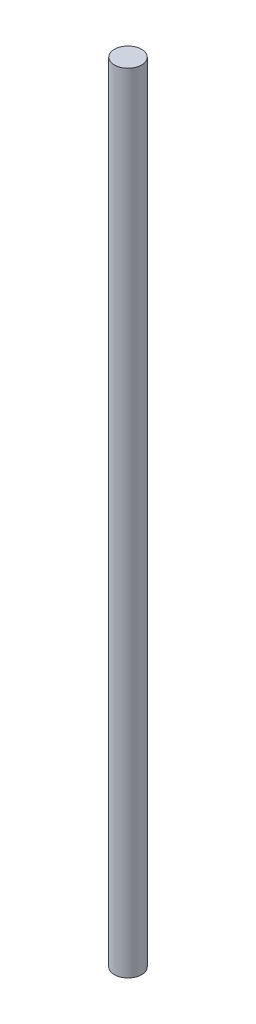
ISO-10303-21;
HEADER;
FILE_DESCRIPTION(('STEP AP214'),'2;1');
FILE_NAME('part.step','',(''),(''),'','','');
FILE_SCHEMA(('AUTOMOTIVE_DESIGN { 1 0 10303 214 1 1 1 1 }'));
ENDSEC;
DATA;
#1=APPLICATION_CONTEXT('core data for automotive mechanical design processes');
#2=APPLICATION_PROTOCOL_DEFINITION('international standard','automotive_design',2000,#1);
#3=PRODUCT_CONTEXT('',#1,'mechanical');
#4=PRODUCT('Part','Part','',(#3));
#5=PRODUCT_RELATED_PRODUCT_CATEGORY('part','',(#4));
#6=PRODUCT_DEFINITION_FORMATION('','',#4);
#7=PRODUCT_DEFINITION_CONTEXT('part definition',#1,'design');
#8=PRODUCT_DEFINITION('design','',#6,#7);
#9=PRODUCT_DEFINITION_SHAPE('','',#8);
#10=(LENGTH_UNIT() NAMED_UNIT(*) SI_UNIT(.MILLI.,.METRE.));
#11=(NAMED_UNIT(*) PLANE_ANGLE_UNIT() SI_UNIT($,.RADIAN.));
#12=(NAMED_UNIT(*) SI_UNIT($,.STERADIAN.) SOLID_ANGLE_UNIT());
#13=UNCERTAINTY_MEASURE_WITH_UNIT(LENGTH_MEASURE(1.E-05),#10,'distance_accuracy_value','');
#14=(GEOMETRIC_REPRESENTATION_CONTEXT(3) GLOBAL_UNCERTAINTY_ASSIGNED_CONTEXT((#13)) GLOBAL_UNIT_ASSIGNED_CONTEXT((#10,
#11,#12)) REPRESENTATION_CONTEXT('',''));
#15=CARTESIAN_POINT('',(0.,0.,0.));
#16=DIRECTION('',(0.,0.,1.));
#17=DIRECTION('',(1.,0.,0.));
#18=AXIS2_PLACEMENT_3D('',#15,#16,#17);
#19=CARTESIAN_POINT('',(0.,130.,0.));
#20=DIRECTION('',(0.,-1.,0.));
#21=DIRECTION('',(0.,0.,-1.));
#22=AXIS2_PLACEMENT_3D('',#19,#20,#21);
#23=CYLINDRICAL_SURFACE('',#22,2.25);
#24=CARTESIAN_POINT('',(0.,130.,0.));
#25=DIRECTION('',(0.,1.,0.));
#26=DIRECTION('',(0.,0.,1.));
#27=AXIS2_PLACEMENT_3D('',#24,#25,#26);
#28=CIRCLE('',#27,2.25);
#29=CARTESIAN_POINT('',(0.,130.,2.25));
#30=VERTEX_POINT('',#29);
#31=EDGE_CURVE('E10',#30,#30,#28,.T.);
#32=ORIENTED_EDGE('',*,*,#31,.F.);
#33=EDGE_LOOP('',(#32));
#34=FACE_BOUND('',#33,.T.);
#35=CARTESIAN_POINT('',(0.,0.,0.));
#36=DIRECTION('',(0.,1.,0.));
#37=DIRECTION('',(0.,0.,1.));
#38=AXIS2_PLACEMENT_3D('',#35,#36,#37);
#39=CIRCLE('',#38,2.25);
#40=CARTESIAN_POINT('',(0.,0.,2.25));
#41=VERTEX_POINT('',#40);
#42=EDGE_CURVE('E40',#41,#41,#39,.T.);
#43=ORIENTED_EDGE('',*,*,#42,.T.);
#44=EDGE_LOOP('',(#43));
#45=FACE_BOUND('',#44,.T.);
#46=ADVANCED_FACE('F37',(#34,#45),#23,.T.);
#47=CARTESIAN_POINT('',(0.,130.,0.));
#48=DIRECTION('',(0.,1.,0.));
#49=DIRECTION('',(0.,0.,1.));
#50=AXIS2_PLACEMENT_3D('',#47,#48,#49);
#51=PLANE('',#50);
#52=ORIENTED_EDGE('',*,*,#31,.T.);
#53=EDGE_LOOP('',(#52));
#54=FACE_BOUND('',#53,.T.);
#55=ADVANCED_FACE('F54',(#54),#51,.T.);
#56=CARTESIAN_POINT('',(0.,0.,0.));
#57=DIRECTION('',(0.,1.,0.));
#58=DIRECTION('',(0.,0.,1.));
#59=AXIS2_PLACEMENT_3D('',#56,#57,#58);
#60=PLANE('',#59);
#61=ORIENTED_EDGE('',*,*,#42,.F.);
#62=EDGE_LOOP('',(#61));
#63=FACE_BOUND('',#62,.T.);
#64=ADVANCED_FACE('F52',(#63),#60,.F.);
#65=CLOSED_SHELL('',(#46,#55,#64));
#66=MANIFOLD_SOLID_BREP('B2',#65);
#67=ADVANCED_BREP_SHAPE_REPRESENTATION('',(#18,#66),#14);
#68=SHAPE_DEFINITION_REPRESENTATION(#9,#67);
ENDSEC;
END-ISO-10303-21;
